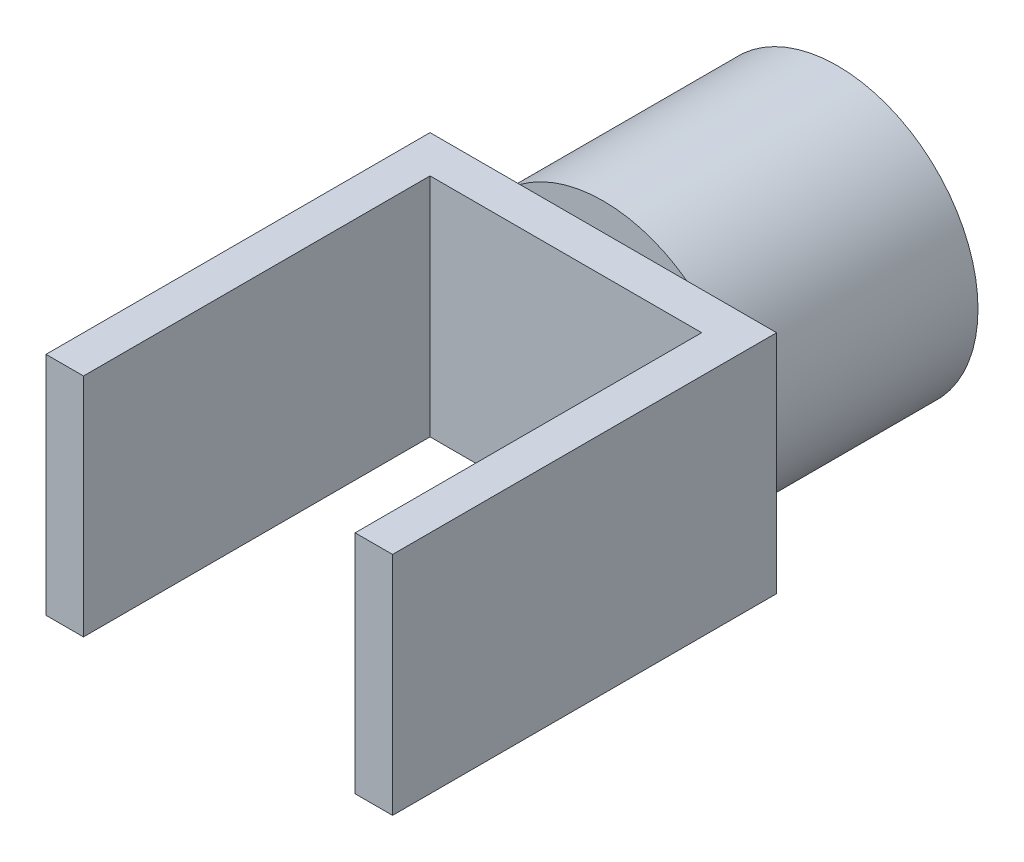
ISO-10303-21;
HEADER;
FILE_DESCRIPTION(('STEP AP214'),'2;1');
FILE_NAME('part.step','',(''),(''),'','','');
FILE_SCHEMA(('AUTOMOTIVE_DESIGN { 1 0 10303 214 1 1 1 1 }'));
ENDSEC;
DATA;
#1=APPLICATION_CONTEXT('core data for automotive mechanical design processes');
#2=APPLICATION_PROTOCOL_DEFINITION('international standard','automotive_design',2000,#1);
#3=PRODUCT_CONTEXT('',#1,'mechanical');
#4=PRODUCT('Part','Part','',(#3));
#5=PRODUCT_RELATED_PRODUCT_CATEGORY('part','',(#4));
#6=PRODUCT_DEFINITION_FORMATION('','',#4);
#7=PRODUCT_DEFINITION_CONTEXT('part definition',#1,'design');
#8=PRODUCT_DEFINITION('design','',#6,#7);
#9=PRODUCT_DEFINITION_SHAPE('','',#8);
#10=(LENGTH_UNIT() NAMED_UNIT(*) SI_UNIT(.MILLI.,.METRE.));
#11=(NAMED_UNIT(*) PLANE_ANGLE_UNIT() SI_UNIT($,.RADIAN.));
#12=(NAMED_UNIT(*) SI_UNIT($,.STERADIAN.) SOLID_ANGLE_UNIT());
#13=UNCERTAINTY_MEASURE_WITH_UNIT(LENGTH_MEASURE(1.E-05),#10,'distance_accuracy_value','');
#14=(GEOMETRIC_REPRESENTATION_CONTEXT(3) GLOBAL_UNCERTAINTY_ASSIGNED_CONTEXT((#13)) GLOBAL_UNIT_ASSIGNED_CONTEXT((#10,
#11,#12)) REPRESENTATION_CONTEXT('',''));
#15=CARTESIAN_POINT('',(0.,0.,0.));
#16=DIRECTION('',(0.,0.,1.));
#17=DIRECTION('',(1.,0.,0.));
#18=AXIS2_PLACEMENT_3D('',#15,#16,#17);
#19=CARTESIAN_POINT('',(0.,0.,250.));
#20=DIRECTION('',(0.,0.,1.));
#21=DIRECTION('',(1.,0.,0.));
#22=AXIS2_PLACEMENT_3D('',#19,#20,#21);
#23=PLANE('',#22);
#24=DIRECTION('',(-1.,0.,0.));
#25=VECTOR('',#24,1.);
#26=CARTESIAN_POINT('',(185.,120.654625871177,250.));
#27=LINE('',#26,#25);
#28=CARTESIAN_POINT('',(89.1204872960545,120.654625871177,250.));
#29=VERTEX_POINT('',#28);
#30=CARTESIAN_POINT('',(-89.1204872960545,120.654625871177,250.));
#31=VERTEX_POINT('',#30);
#32=EDGE_CURVE('E50',#29,#31,#27,.T.);
#33=ORIENTED_EDGE('',*,*,#32,.F.);
#34=CARTESIAN_POINT('',(0.,0.,250.));
#35=DIRECTION('',(0.,0.,1.));
#36=DIRECTION('',(1.,0.,0.));
#37=AXIS2_PLACEMENT_3D('',#34,#35,#36);
#38=CIRCLE('',#37,150.);
#39=EDGE_CURVE('E196',#29,#31,#38,.T.);
#40=ORIENTED_EDGE('',*,*,#39,.T.);
#41=EDGE_LOOP('',(#33,#40));
#42=FACE_BOUND('',#41,.T.);
#43=ADVANCED_FACE('F39',(#42),#23,.T.);
#44=CARTESIAN_POINT('',(0.,0.,250.));
#45=DIRECTION('',(0.,0.,-1.));
#46=DIRECTION('',(-1.,0.,0.));
#47=AXIS2_PLACEMENT_3D('',#44,#45,#46);
#48=CYLINDRICAL_SURFACE('',#47,150.);
#49=ORIENTED_EDGE('',*,*,#39,.F.);
#50=CARTESIAN_POINT('',(89.1204872960545,-120.654625871177,250.));
#51=VERTEX_POINT('',#50);
#52=EDGE_CURVE('E203',#51,#29,#38,.T.);
#53=ORIENTED_EDGE('',*,*,#52,.F.);
#54=CARTESIAN_POINT('',(-89.1204872960545,-120.654625871177,250.));
#55=VERTEX_POINT('',#54);
#56=EDGE_CURVE('E206',#55,#51,#38,.T.);
#57=ORIENTED_EDGE('',*,*,#56,.F.);
#58=EDGE_CURVE('E199',#31,#55,#38,.T.);
#59=ORIENTED_EDGE('',*,*,#58,.F.);
#60=EDGE_LOOP('',(#49,#53,#57,#59));
#61=FACE_BOUND('',#60,.T.);
#62=CARTESIAN_POINT('',(0.,0.,0.));
#63=DIRECTION('',(0.,0.,1.));
#64=DIRECTION('',(1.,0.,0.));
#65=AXIS2_PLACEMENT_3D('',#62,#63,#64);
#66=CIRCLE('',#65,150.);
#67=CARTESIAN_POINT('',(150.,0.,0.));
#68=VERTEX_POINT('',#67);
#69=EDGE_CURVE('E193',#68,#68,#66,.T.);
#70=ORIENTED_EDGE('',*,*,#69,.T.);
#71=EDGE_LOOP('',(#70));
#72=FACE_BOUND('',#71,.T.);
#73=ADVANCED_FACE('F41',(#61,#72),#48,.T.);
#74=DIRECTION('',(1.,0.,0.));
#75=VECTOR('',#74,1.);
#76=CARTESIAN_POINT('',(185.,-120.654625871177,250.));
#77=LINE('',#76,#75);
#78=EDGE_CURVE('E182',#55,#51,#77,.T.);
#79=ORIENTED_EDGE('',*,*,#78,.F.);
#80=ORIENTED_EDGE('',*,*,#56,.T.);
#81=EDGE_LOOP('',(#79,#80));
#82=FACE_BOUND('',#81,.T.);
#83=ADVANCED_FACE('F245',(#82),#23,.T.);
#84=CARTESIAN_POINT('',(0.,0.,0.));
#85=DIRECTION('',(0.,0.,1.));
#86=DIRECTION('',(1.,0.,0.));
#87=AXIS2_PLACEMENT_3D('',#84,#85,#86);
#88=PLANE('',#87);
#89=CARTESIAN_POINT('',(0.,0.,0.));
#90=DIRECTION('',(0.,0.,-1.));
#91=DIRECTION('',(-1.,0.,0.));
#92=AXIS2_PLACEMENT_3D('',#89,#90,#91);
#93=CIRCLE('',#92,70.);
#94=CARTESIAN_POINT('',(-70.,0.,0.));
#95=VERTEX_POINT('',#94);
#96=EDGE_CURVE('E192',#95,#95,#93,.T.);
#97=ORIENTED_EDGE('',*,*,#96,.F.);
#98=EDGE_LOOP('',(#97));
#99=FACE_BOUND('',#98,.T.);
#100=ORIENTED_EDGE('',*,*,#69,.F.);
#101=EDGE_LOOP('',(#100));
#102=FACE_BOUND('',#101,.T.);
#103=ADVANCED_FACE('F247',(#99,#102),#88,.F.);
#104=CARTESIAN_POINT('',(0.,0.,-10.));
#105=DIRECTION('',(0.,0.,1.));
#106=DIRECTION('',(1.,0.,0.));
#107=AXIS2_PLACEMENT_3D('',#104,#105,#106);
#108=CYLINDRICAL_SURFACE('',#107,70.);
#109=CARTESIAN_POINT('',(0.,0.,-10.));
#110=DIRECTION('',(0.,0.,-1.));
#111=DIRECTION('',(-1.,0.,0.));
#112=AXIS2_PLACEMENT_3D('',#109,#110,#111);
#113=CIRCLE('',#112,70.);
#114=CARTESIAN_POINT('',(-70.,0.,-10.));
#115=VERTEX_POINT('',#114);
#116=EDGE_CURVE('E127',#115,#115,#113,.T.);
#117=ORIENTED_EDGE('',*,*,#116,.F.);
#118=EDGE_LOOP('',(#117));
#119=FACE_BOUND('',#118,.T.);
#120=ORIENTED_EDGE('',*,*,#96,.T.);
#121=EDGE_LOOP('',(#120));
#122=FACE_BOUND('',#121,.T.);
#123=ADVANCED_FACE('F254',(#119,#122),#108,.T.);
#124=CARTESIAN_POINT('',(0.,0.,-10.));
#125=DIRECTION('',(0.,0.,-1.));
#126=DIRECTION('',(-1.,0.,0.));
#127=AXIS2_PLACEMENT_3D('',#124,#125,#126);
#128=PLANE('',#127);
#129=ORIENTED_EDGE('',*,*,#116,.T.);
#130=EDGE_LOOP('',(#129));
#131=FACE_BOUND('',#130,.T.);
#132=ADVANCED_FACE('F257',(#131),#128,.T.);
#133=CARTESIAN_POINT('',(0.,0.,250.));
#134=DIRECTION('',(0.,0.,1.));
#135=DIRECTION('',(1.,0.,0.));
#136=AXIS2_PLACEMENT_3D('',#133,#134,#135);
#137=PLANE('',#136);
#138=CARTESIAN_POINT('',(-185.,120.654625871177,250.));
#139=VERTEX_POINT('',#138);
#140=EDGE_CURVE('E181',#31,#139,#27,.T.);
#141=ORIENTED_EDGE('',*,*,#140,.F.);
#142=ORIENTED_EDGE('',*,*,#58,.T.);
#143=CARTESIAN_POINT('',(-185.,-120.654625871177,250.));
#144=VERTEX_POINT('',#143);
#145=EDGE_CURVE('E180',#144,#55,#77,.T.);
#146=ORIENTED_EDGE('',*,*,#145,.F.);
#147=DIRECTION('',(0.,-1.,0.));
#148=VECTOR('',#147,1.);
#149=CARTESIAN_POINT('',(-185.,-120.654625871177,250.));
#150=LINE('',#149,#148);
#151=EDGE_CURVE('E125',#139,#144,#150,.T.);
#152=ORIENTED_EDGE('',*,*,#151,.F.);
#153=EDGE_LOOP('',(#141,#142,#146,#152));
#154=FACE_BOUND('',#153,.T.);
#155=ADVANCED_FACE('F216',(#154),#137,.F.);
#156=CARTESIAN_POINT('',(185.,-120.654625871177,250.));
#157=VERTEX_POINT('',#156);
#158=EDGE_CURVE('E176',#51,#157,#77,.T.);
#159=ORIENTED_EDGE('',*,*,#158,.F.);
#160=ORIENTED_EDGE('',*,*,#52,.T.);
#161=CARTESIAN_POINT('',(185.,120.654625871177,250.));
#162=VERTEX_POINT('',#161);
#163=EDGE_CURVE('E175',#162,#29,#27,.T.);
#164=ORIENTED_EDGE('',*,*,#163,.F.);
#165=DIRECTION('',(0.,1.,0.));
#166=VECTOR('',#165,1.);
#167=CARTESIAN_POINT('',(185.,-120.654625871177,250.));
#168=LINE('',#167,#166);
#169=EDGE_CURVE('E177',#157,#162,#168,.T.);
#170=ORIENTED_EDGE('',*,*,#169,.F.);
#171=EDGE_LOOP('',(#159,#160,#164,#170));
#172=FACE_BOUND('',#171,.T.);
#173=ADVANCED_FACE('F272',(#172),#137,.F.);
#174=CARTESIAN_POINT('',(-185.,-120.654625871177,290.));
#175=DIRECTION('',(1.,0.,0.));
#176=DIRECTION('',(0.,0.,-1.));
#177=AXIS2_PLACEMENT_3D('',#174,#175,#176);
#178=PLANE('',#177);
#179=ORIENTED_EDGE('',*,*,#151,.T.);
#180=DIRECTION('',(0.,0.,-1.));
#181=VECTOR('',#180,1.);
#182=CARTESIAN_POINT('',(-185.,-120.654625871177,290.));
#183=LINE('',#182,#181);
#184=CARTESIAN_POINT('',(-185.,-120.654625871177,660.));
#185=VERTEX_POINT('',#184);
#186=EDGE_CURVE('E119',#185,#144,#183,.T.);
#187=ORIENTED_EDGE('',*,*,#186,.F.);
#188=DIRECTION('',(0.,-1.,0.));
#189=VECTOR('',#188,1.);
#190=CARTESIAN_POINT('',(-185.,-120.654625871177,660.));
#191=LINE('',#190,#189);
#192=CARTESIAN_POINT('',(-185.,120.654625871177,660.));
#193=VERTEX_POINT('',#192);
#194=EDGE_CURVE('E124',#193,#185,#191,.T.);
#195=ORIENTED_EDGE('',*,*,#194,.F.);
#196=DIRECTION('',(0.,0.,-1.));
#197=VECTOR('',#196,1.);
#198=CARTESIAN_POINT('',(-185.,120.654625871177,290.));
#199=LINE('',#198,#197);
#200=EDGE_CURVE('E172',#193,#139,#199,.T.);
#201=ORIENTED_EDGE('',*,*,#200,.T.);
#202=EDGE_LOOP('',(#179,#187,#195,#201));
#203=FACE_BOUND('',#202,.T.);
#204=ADVANCED_FACE('F120',(#203),#178,.F.);
#205=CARTESIAN_POINT('',(185.,-120.654625871177,290.));
#206=DIRECTION('',(0.,1.,0.));
#207=DIRECTION('',(-1.,0.,0.));
#208=AXIS2_PLACEMENT_3D('',#205,#206,#207);
#209=PLANE('',#208);
#210=ORIENTED_EDGE('',*,*,#145,.T.);
#211=ORIENTED_EDGE('',*,*,#78,.T.);
#212=ORIENTED_EDGE('',*,*,#158,.T.);
#213=DIRECTION('',(0.,0.,-1.));
#214=VECTOR('',#213,1.);
#215=CARTESIAN_POINT('',(185.,-120.654625871177,290.));
#216=LINE('',#215,#214);
#217=CARTESIAN_POINT('',(185.,-120.654625871177,660.));
#218=VERTEX_POINT('',#217);
#219=EDGE_CURVE('E130',#218,#157,#216,.T.);
#220=ORIENTED_EDGE('',*,*,#219,.F.);
#221=DIRECTION('',(1.,0.,0.));
#222=VECTOR('',#221,1.);
#223=CARTESIAN_POINT('',(185.,-120.654625871177,660.));
#224=LINE('',#223,#222);
#225=CARTESIAN_POINT('',(145.,-120.654625871177,660.));
#226=VERTEX_POINT('',#225);
#227=EDGE_CURVE('E157',#226,#218,#224,.T.);
#228=ORIENTED_EDGE('',*,*,#227,.F.);
#229=DIRECTION('',(0.,0.,-1.));
#230=VECTOR('',#229,1.);
#231=CARTESIAN_POINT('',(145.,-120.654625871177,660.));
#232=LINE('',#231,#230);
#233=CARTESIAN_POINT('',(145.,-120.654625871177,290.));
#234=VERTEX_POINT('',#233);
#235=EDGE_CURVE('E156',#226,#234,#232,.T.);
#236=ORIENTED_EDGE('',*,*,#235,.T.);
#237=DIRECTION('',(1.,0.,0.));
#238=VECTOR('',#237,1.);
#239=CARTESIAN_POINT('',(185.,-120.654625871177,290.));
#240=LINE('',#239,#238);
#241=CARTESIAN_POINT('',(-145.,-120.654625871177,290.));
#242=VERTEX_POINT('',#241);
#243=EDGE_CURVE('E168',#242,#234,#240,.T.);
#244=ORIENTED_EDGE('',*,*,#243,.F.);
#245=DIRECTION('',(0.,0.,-1.));
#246=VECTOR('',#245,1.);
#247=CARTESIAN_POINT('',(-145.,-120.654625871177,660.));
#248=LINE('',#247,#246);
#249=CARTESIAN_POINT('',(-145.,-120.654625871177,660.));
#250=VERTEX_POINT('',#249);
#251=EDGE_CURVE('E135',#250,#242,#248,.T.);
#252=ORIENTED_EDGE('',*,*,#251,.F.);
#253=DIRECTION('',(1.,0.,0.));
#254=VECTOR('',#253,1.);
#255=CARTESIAN_POINT('',(-185.,-120.654625871177,660.));
#256=LINE('',#255,#254);
#257=EDGE_CURVE('E128',#185,#250,#256,.T.);
#258=ORIENTED_EDGE('',*,*,#257,.F.);
#259=ORIENTED_EDGE('',*,*,#186,.T.);
#260=EDGE_LOOP('',(#210,#211,#212,#220,#228,#236,#244,#252,#258,#259));
#261=FACE_BOUND('',#260,.T.);
#262=ADVANCED_FACE('F134',(#261),#209,.F.);
#263=CARTESIAN_POINT('',(185.,-120.654625871177,290.));
#264=DIRECTION('',(-1.,0.,0.));
#265=DIRECTION('',(0.,0.,1.));
#266=AXIS2_PLACEMENT_3D('',#263,#264,#265);
#267=PLANE('',#266);
#268=ORIENTED_EDGE('',*,*,#169,.T.);
#269=DIRECTION('',(0.,0.,-1.));
#270=VECTOR('',#269,1.);
#271=CARTESIAN_POINT('',(185.,120.654625871177,290.));
#272=LINE('',#271,#270);
#273=CARTESIAN_POINT('',(185.,120.654625871177,660.));
#274=VERTEX_POINT('',#273);
#275=EDGE_CURVE('E186',#274,#162,#272,.T.);
#276=ORIENTED_EDGE('',*,*,#275,.F.);
#277=DIRECTION('',(0.,1.,0.));
#278=VECTOR('',#277,1.);
#279=CARTESIAN_POINT('',(185.,-120.654625871177,660.));
#280=LINE('',#279,#278);
#281=EDGE_CURVE('E161',#218,#274,#280,.T.);
#282=ORIENTED_EDGE('',*,*,#281,.F.);
#283=ORIENTED_EDGE('',*,*,#219,.T.);
#284=EDGE_LOOP('',(#268,#276,#282,#283));
#285=FACE_BOUND('',#284,.T.);
#286=ADVANCED_FACE('F277',(#285),#267,.F.);
#287=CARTESIAN_POINT('',(185.,120.654625871177,290.));
#288=DIRECTION('',(0.,-1.,0.));
#289=DIRECTION('',(1.,0.,0.));
#290=AXIS2_PLACEMENT_3D('',#287,#288,#289);
#291=PLANE('',#290);
#292=ORIENTED_EDGE('',*,*,#163,.T.);
#293=ORIENTED_EDGE('',*,*,#32,.T.);
#294=ORIENTED_EDGE('',*,*,#140,.T.);
#295=ORIENTED_EDGE('',*,*,#200,.F.);
#296=DIRECTION('',(-1.,0.,0.));
#297=VECTOR('',#296,1.);
#298=CARTESIAN_POINT('',(-185.,120.654625871177,660.));
#299=LINE('',#298,#297);
#300=CARTESIAN_POINT('',(-145.,120.654625871177,660.));
#301=VERTEX_POINT('',#300);
#302=EDGE_CURVE('E143',#301,#193,#299,.T.);
#303=ORIENTED_EDGE('',*,*,#302,.F.);
#304=DIRECTION('',(0.,0.,-1.));
#305=VECTOR('',#304,1.);
#306=CARTESIAN_POINT('',(-145.,120.654625871177,660.));
#307=LINE('',#306,#305);
#308=CARTESIAN_POINT('',(-145.,120.654625871177,290.));
#309=VERTEX_POINT('',#308);
#310=EDGE_CURVE('E146',#301,#309,#307,.T.);
#311=ORIENTED_EDGE('',*,*,#310,.T.);
#312=DIRECTION('',(-1.,0.,0.));
#313=VECTOR('',#312,1.);
#314=CARTESIAN_POINT('',(185.,120.654625871177,290.));
#315=LINE('',#314,#313);
#316=CARTESIAN_POINT('',(145.,120.654625871177,290.));
#317=VERTEX_POINT('',#316);
#318=EDGE_CURVE('E171',#317,#309,#315,.T.);
#319=ORIENTED_EDGE('',*,*,#318,.F.);
#320=DIRECTION('',(0.,0.,-1.));
#321=VECTOR('',#320,1.);
#322=CARTESIAN_POINT('',(145.,120.654625871177,660.));
#323=LINE('',#322,#321);
#324=CARTESIAN_POINT('',(145.,120.654625871177,660.));
#325=VERTEX_POINT('',#324);
#326=EDGE_CURVE('E153',#325,#317,#323,.T.);
#327=ORIENTED_EDGE('',*,*,#326,.F.);
#328=DIRECTION('',(-1.,0.,0.));
#329=VECTOR('',#328,1.);
#330=CARTESIAN_POINT('',(185.,120.654625871177,660.));
#331=LINE('',#330,#329);
#332=EDGE_CURVE('E167',#274,#325,#331,.T.);
#333=ORIENTED_EDGE('',*,*,#332,.F.);
#334=ORIENTED_EDGE('',*,*,#275,.T.);
#335=EDGE_LOOP('',(#292,#293,#294,#295,#303,#311,#319,#327,#333,#334));
#336=FACE_BOUND('',#335,.T.);
#337=ADVANCED_FACE('F225',(#336),#291,.F.);
#338=CARTESIAN_POINT('',(0.,0.,290.));
#339=DIRECTION('',(0.,0.,1.));
#340=DIRECTION('',(1.,0.,0.));
#341=AXIS2_PLACEMENT_3D('',#338,#339,#340);
#342=PLANE('',#341);
#343=DIRECTION('',(0.,1.,0.));
#344=VECTOR('',#343,1.);
#345=CARTESIAN_POINT('',(-145.,-120.654625871177,290.));
#346=LINE('',#345,#344);
#347=EDGE_CURVE('E56',#242,#309,#346,.T.);
#348=ORIENTED_EDGE('',*,*,#347,.F.);
#349=ORIENTED_EDGE('',*,*,#243,.T.);
#350=DIRECTION('',(0.,-1.,0.));
#351=VECTOR('',#350,1.);
#352=CARTESIAN_POINT('',(145.,-120.654625871177,290.));
#353=LINE('',#352,#351);
#354=EDGE_CURVE('E53',#317,#234,#353,.T.);
#355=ORIENTED_EDGE('',*,*,#354,.F.);
#356=ORIENTED_EDGE('',*,*,#318,.T.);
#357=EDGE_LOOP('',(#348,#349,#355,#356));
#358=FACE_BOUND('',#357,.T.);
#359=ADVANCED_FACE('F281',(#358),#342,.T.);
#360=CARTESIAN_POINT('',(145.,-120.654625871177,660.));
#361=DIRECTION('',(1.,0.,0.));
#362=DIRECTION('',(0.,0.,-1.));
#363=AXIS2_PLACEMENT_3D('',#360,#361,#362);
#364=PLANE('',#363);
#365=CARTESIAN_POINT('',(145.,-0.654625871177414,560.));
#366=DIRECTION('',(1.,0.,0.));
#367=DIRECTION('',(0.,0.,-1.));
#368=AXIS2_PLACEMENT_3D('',#365,#366,#367);
#369=CIRCLE('',#368,70.0000000000002);
#370=CARTESIAN_POINT('',(145.,-0.654625871177414,490.));
#371=VERTEX_POINT('',#370);
#372=EDGE_CURVE('E11',#371,#371,#369,.F.);
#373=ORIENTED_EDGE('',*,*,#372,.F.);
#374=EDGE_LOOP('',(#373));
#375=FACE_BOUND('',#374,.T.);
#376=ORIENTED_EDGE('',*,*,#354,.T.);
#377=ORIENTED_EDGE('',*,*,#235,.F.);
#378=DIRECTION('',(0.,-1.,0.));
#379=VECTOR('',#378,1.);
#380=CARTESIAN_POINT('',(145.,-120.654625871177,660.));
#381=LINE('',#380,#379);
#382=EDGE_CURVE('E163',#325,#226,#381,.T.);
#383=ORIENTED_EDGE('',*,*,#382,.F.);
#384=ORIENTED_EDGE('',*,*,#326,.T.);
#385=EDGE_LOOP('',(#376,#377,#383,#384));
#386=FACE_BOUND('',#385,.T.);
#387=ADVANCED_FACE('F237',(#375,#386),#364,.F.);
#388=CARTESIAN_POINT('',(0.,0.,660.));
#389=DIRECTION('',(0.,0.,1.));
#390=DIRECTION('',(1.,0.,0.));
#391=AXIS2_PLACEMENT_3D('',#388,#389,#390);
#392=PLANE('',#391);
#393=ORIENTED_EDGE('',*,*,#281,.T.);
#394=ORIENTED_EDGE('',*,*,#332,.T.);
#395=ORIENTED_EDGE('',*,*,#382,.T.);
#396=ORIENTED_EDGE('',*,*,#227,.T.);
#397=EDGE_LOOP('',(#393,#394,#395,#396));
#398=FACE_BOUND('',#397,.T.);
#399=ADVANCED_FACE('F230',(#398),#392,.T.);
#400=CARTESIAN_POINT('',(-145.,-120.654625871177,660.));
#401=DIRECTION('',(-1.,0.,0.));
#402=DIRECTION('',(0.,-1.,0.));
#403=AXIS2_PLACEMENT_3D('',#400,#401,#402);
#404=PLANE('',#403);
#405=ORIENTED_EDGE('',*,*,#347,.T.);
#406=ORIENTED_EDGE('',*,*,#310,.F.);
#407=DIRECTION('',(0.,1.,0.));
#408=VECTOR('',#407,1.);
#409=CARTESIAN_POINT('',(-145.,-120.654625871177,660.));
#410=LINE('',#409,#408);
#411=EDGE_CURVE('E139',#250,#301,#410,.T.);
#412=ORIENTED_EDGE('',*,*,#411,.F.);
#413=ORIENTED_EDGE('',*,*,#251,.T.);
#414=EDGE_LOOP('',(#405,#406,#412,#413));
#415=FACE_BOUND('',#414,.T.);
#416=ADVANCED_FACE('F229',(#415),#404,.F.);
#417=CARTESIAN_POINT('',(0.,0.,660.));
#418=DIRECTION('',(0.,0.,-1.));
#419=DIRECTION('',(-1.,0.,0.));
#420=AXIS2_PLACEMENT_3D('',#417,#418,#419);
#421=PLANE('',#420);
#422=ORIENTED_EDGE('',*,*,#194,.T.);
#423=ORIENTED_EDGE('',*,*,#257,.T.);
#424=ORIENTED_EDGE('',*,*,#411,.T.);
#425=ORIENTED_EDGE('',*,*,#302,.T.);
#426=EDGE_LOOP('',(#422,#423,#424,#425));
#427=FACE_BOUND('',#426,.T.);
#428=ADVANCED_FACE('F138',(#427),#421,.F.);
#429=CARTESIAN_POINT('',(135.,-0.654625871177414,560.));
#430=DIRECTION('',(1.,0.,0.));
#431=DIRECTION('',(0.,0.,-1.));
#432=AXIS2_PLACEMENT_3D('',#429,#430,#431);
#433=CYLINDRICAL_SURFACE('',#432,70.0000000000002);
#434=CARTESIAN_POINT('',(135.,-0.654625871177414,560.));
#435=DIRECTION('',(-1.,0.,0.));
#436=DIRECTION('',(0.,0.,1.));
#437=AXIS2_PLACEMENT_3D('',#434,#435,#436);
#438=CIRCLE('',#437,70.0000000000002);
#439=CARTESIAN_POINT('',(135.,-0.654625871177414,630.));
#440=VERTEX_POINT('',#439);
#441=EDGE_CURVE('E144',#440,#440,#438,.T.);
#442=ORIENTED_EDGE('',*,*,#441,.F.);
#443=EDGE_LOOP('',(#442));
#444=FACE_BOUND('',#443,.T.);
#445=ORIENTED_EDGE('',*,*,#372,.T.);
#446=EDGE_LOOP('',(#445));
#447=FACE_BOUND('',#446,.T.);
#448=ADVANCED_FACE('F233',(#444,#447),#433,.T.);
#449=CARTESIAN_POINT('',(135.,-0.654625871177414,560.));
#450=DIRECTION('',(-1.,0.,0.));
#451=DIRECTION('',(0.,0.,1.));
#452=AXIS2_PLACEMENT_3D('',#449,#450,#451);
#453=PLANE('',#452);
#454=ORIENTED_EDGE('',*,*,#441,.T.);
#455=EDGE_LOOP('',(#454));
#456=FACE_BOUND('',#455,.T.);
#457=ADVANCED_FACE('F359',(#456),#453,.T.);
#458=CLOSED_SHELL('',(#43,#73,#83,#103,#123,#132,#155,#173,#204,#262,#286,#337,#359,#387,#399,
#416,#428,#448,#457));
#459=MANIFOLD_SOLID_BREP('B2',#458);
#460=ADVANCED_BREP_SHAPE_REPRESENTATION('',(#18,#459),#14);
#461=SHAPE_DEFINITION_REPRESENTATION(#9,#460);
ENDSEC;
END-ISO-10303-21;
